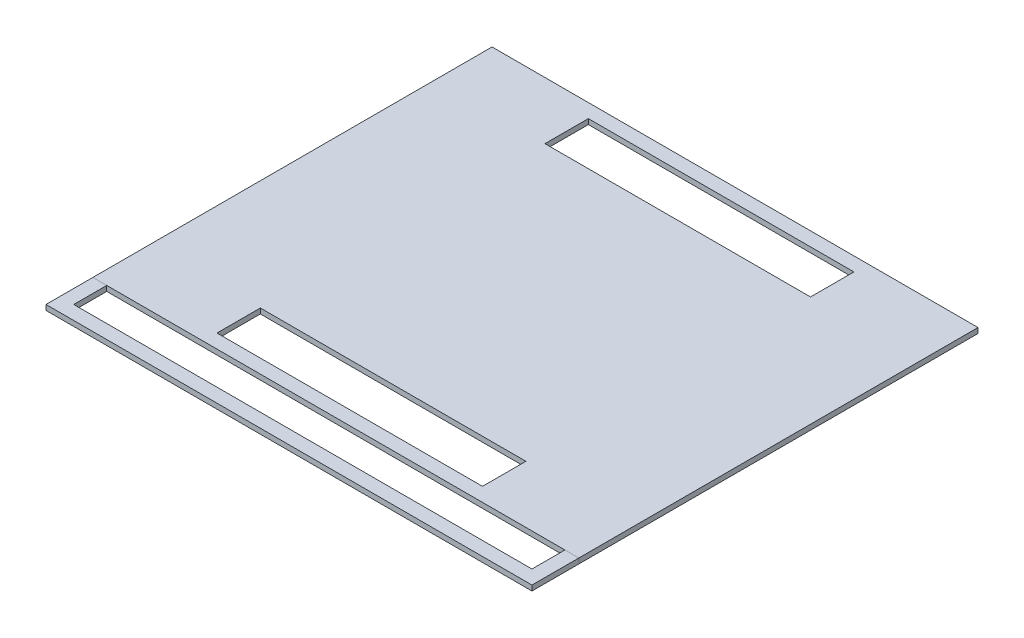
ISO-10303-21;
HEADER;
FILE_DESCRIPTION(('STEP AP214'),'2;1');
FILE_NAME('part.step','',(''),(''),'','','');
FILE_SCHEMA(('AUTOMOTIVE_DESIGN { 1 0 10303 214 1 1 1 1 }'));
ENDSEC;
DATA;
#1=APPLICATION_CONTEXT('core data for automotive mechanical design processes');
#2=APPLICATION_PROTOCOL_DEFINITION('international standard','automotive_design',2000,#1);
#3=PRODUCT_CONTEXT('',#1,'mechanical');
#4=PRODUCT('Part','Part','',(#3));
#5=PRODUCT_RELATED_PRODUCT_CATEGORY('part','',(#4));
#6=PRODUCT_DEFINITION_FORMATION('','',#4);
#7=PRODUCT_DEFINITION_CONTEXT('part definition',#1,'design');
#8=PRODUCT_DEFINITION('design','',#6,#7);
#9=PRODUCT_DEFINITION_SHAPE('','',#8);
#10=(LENGTH_UNIT() NAMED_UNIT(*) SI_UNIT(.MILLI.,.METRE.));
#11=(NAMED_UNIT(*) PLANE_ANGLE_UNIT() SI_UNIT($,.RADIAN.));
#12=(NAMED_UNIT(*) SI_UNIT($,.STERADIAN.) SOLID_ANGLE_UNIT());
#13=UNCERTAINTY_MEASURE_WITH_UNIT(LENGTH_MEASURE(1.E-05),#10,'distance_accuracy_value','');
#14=(GEOMETRIC_REPRESENTATION_CONTEXT(3) GLOBAL_UNCERTAINTY_ASSIGNED_CONTEXT((#13)) GLOBAL_UNIT_ASSIGNED_CONTEXT((#10,
#11,#12)) REPRESENTATION_CONTEXT('',''));
#15=CARTESIAN_POINT('',(0.,0.,0.));
#16=DIRECTION('',(0.,0.,1.));
#17=DIRECTION('',(1.,0.,0.));
#18=AXIS2_PLACEMENT_3D('',#15,#16,#17);
#19=CARTESIAN_POINT('',(-280.,0.,0.));
#20=DIRECTION('',(0.,0.,-1.));
#21=DIRECTION('',(-1.,0.,0.));
#22=AXIS2_PLACEMENT_3D('',#19,#20,#21);
#23=PLANE('',#22);
#24=DIRECTION('',(0.,1.,0.));
#25=VECTOR('',#24,1.);
#26=CARTESIAN_POINT('',(-272.,0.,0.));
#27=LINE('',#26,#25);
#28=CARTESIAN_POINT('',(-272.,0.,0.));
#29=VERTEX_POINT('',#28);
#30=CARTESIAN_POINT('',(-272.,3.,0.));
#31=VERTEX_POINT('',#30);
#32=EDGE_CURVE('E150',#29,#31,#27,.T.);
#33=ORIENTED_EDGE('',*,*,#32,.F.);
#34=DIRECTION('',(-1.,0.,0.));
#35=VECTOR('',#34,1.);
#36=CARTESIAN_POINT('',(-280.,0.,0.));
#37=LINE('',#36,#35);
#38=CARTESIAN_POINT('',(-280.,0.,0.));
#39=VERTEX_POINT('',#38);
#40=EDGE_CURVE('E74',#29,#39,#37,.T.);
#41=ORIENTED_EDGE('',*,*,#40,.T.);
#42=DIRECTION('',(0.,1.,0.));
#43=VECTOR('',#42,1.);
#44=CARTESIAN_POINT('',(-280.,0.,0.));
#45=LINE('',#44,#43);
#46=CARTESIAN_POINT('',(-280.,3.,0.));
#47=VERTEX_POINT('',#46);
#48=EDGE_CURVE('E12',#39,#47,#45,.T.);
#49=ORIENTED_EDGE('',*,*,#48,.T.);
#50=DIRECTION('',(-1.,0.,0.));
#51=VECTOR('',#50,1.);
#52=CARTESIAN_POINT('',(-280.,3.,0.));
#53=LINE('',#52,#51);
#54=EDGE_CURVE('E96',#31,#47,#53,.T.);
#55=ORIENTED_EDGE('',*,*,#54,.F.);
#56=EDGE_LOOP('',(#33,#41,#49,#55));
#57=FACE_BOUND('',#56,.T.);
#58=ADVANCED_FACE('F49',(#57),#23,.T.);
#59=CARTESIAN_POINT('',(-280.,0.,0.));
#60=DIRECTION('',(-1.,0.,0.));
#61=DIRECTION('',(0.,0.,1.));
#62=AXIS2_PLACEMENT_3D('',#59,#60,#61);
#63=PLANE('',#62);
#64=DIRECTION('',(0.,0.,1.));
#65=VECTOR('',#64,1.);
#66=CARTESIAN_POINT('',(-280.,3.,0.));
#67=LINE('',#66,#65);
#68=CARTESIAN_POINT('',(-280.,3.,27.));
#69=VERTEX_POINT('',#68);
#70=EDGE_CURVE('E152',#47,#69,#67,.T.);
#71=ORIENTED_EDGE('',*,*,#70,.F.);
#72=ORIENTED_EDGE('',*,*,#48,.F.);
#73=DIRECTION('',(0.,0.,1.));
#74=VECTOR('',#73,1.);
#75=CARTESIAN_POINT('',(-280.,0.,0.));
#76=LINE('',#75,#74);
#77=CARTESIAN_POINT('',(-280.,0.,27.));
#78=VERTEX_POINT('',#77);
#79=EDGE_CURVE('E157',#39,#78,#76,.T.);
#80=ORIENTED_EDGE('',*,*,#79,.T.);
#81=DIRECTION('',(0.,1.,0.));
#82=VECTOR('',#81,1.);
#83=CARTESIAN_POINT('',(-280.,0.,27.));
#84=LINE('',#83,#82);
#85=EDGE_CURVE('E53',#78,#69,#84,.T.);
#86=ORIENTED_EDGE('',*,*,#85,.T.);
#87=EDGE_LOOP('',(#71,#72,#80,#86));
#88=FACE_BOUND('',#87,.T.);
#89=ADVANCED_FACE('F51',(#88),#63,.T.);
#90=DIRECTION('',(0.,1.,0.));
#91=VECTOR('',#90,1.);
#92=CARTESIAN_POINT('',(-8.,0.,0.));
#93=LINE('',#92,#91);
#94=CARTESIAN_POINT('',(-8.,0.,0.));
#95=VERTEX_POINT('',#94);
#96=CARTESIAN_POINT('',(-8.,3.,0.));
#97=VERTEX_POINT('',#96);
#98=EDGE_CURVE('E153',#95,#97,#93,.T.);
#99=ORIENTED_EDGE('',*,*,#98,.T.);
#100=CARTESIAN_POINT('',(0.,3.,0.));
#101=VERTEX_POINT('',#100);
#102=EDGE_CURVE('E161',#101,#97,#53,.T.);
#103=ORIENTED_EDGE('',*,*,#102,.F.);
#104=DIRECTION('',(0.,1.,0.));
#105=VECTOR('',#104,1.);
#106=CARTESIAN_POINT('',(0.,0.,0.));
#107=LINE('',#106,#105);
#108=CARTESIAN_POINT('',(0.,0.,0.));
#109=VERTEX_POINT('',#108);
#110=EDGE_CURVE('E58',#109,#101,#107,.T.);
#111=ORIENTED_EDGE('',*,*,#110,.F.);
#112=EDGE_CURVE('E166',#109,#95,#37,.T.);
#113=ORIENTED_EDGE('',*,*,#112,.T.);
#114=EDGE_LOOP('',(#99,#103,#111,#113));
#115=FACE_BOUND('',#114,.T.);
#116=ADVANCED_FACE('F195',(#115),#23,.T.);
#117=CARTESIAN_POINT('',(0.,0.,0.));
#118=DIRECTION('',(1.,0.,0.));
#119=DIRECTION('',(0.,0.,-1.));
#120=AXIS2_PLACEMENT_3D('',#117,#118,#119);
#121=PLANE('',#120);
#122=DIRECTION('',(0.,0.,-1.));
#123=VECTOR('',#122,1.);
#124=CARTESIAN_POINT('',(0.,3.,0.));
#125=LINE('',#124,#123);
#126=CARTESIAN_POINT('',(0.,3.,27.));
#127=VERTEX_POINT('',#126);
#128=EDGE_CURVE('E173',#127,#101,#125,.T.);
#129=ORIENTED_EDGE('',*,*,#128,.F.);
#130=DIRECTION('',(0.,1.,0.));
#131=VECTOR('',#130,1.);
#132=CARTESIAN_POINT('',(0.,0.,27.));
#133=LINE('',#132,#131);
#134=CARTESIAN_POINT('',(0.,0.,27.));
#135=VERTEX_POINT('',#134);
#136=EDGE_CURVE('E178',#135,#127,#133,.T.);
#137=ORIENTED_EDGE('',*,*,#136,.F.);
#138=DIRECTION('',(0.,0.,-1.));
#139=VECTOR('',#138,1.);
#140=CARTESIAN_POINT('',(0.,0.,0.));
#141=LINE('',#140,#139);
#142=EDGE_CURVE('E163',#135,#109,#141,.T.);
#143=ORIENTED_EDGE('',*,*,#142,.T.);
#144=ORIENTED_EDGE('',*,*,#110,.T.);
#145=EDGE_LOOP('',(#129,#137,#143,#144));
#146=FACE_BOUND('',#145,.T.);
#147=ADVANCED_FACE('F201',(#146),#121,.T.);
#148=CARTESIAN_POINT('',(-280.,0.,27.));
#149=DIRECTION('',(0.,0.,1.));
#150=DIRECTION('',(1.,0.,0.));
#151=AXIS2_PLACEMENT_3D('',#148,#149,#150);
#152=PLANE('',#151);
#153=DIRECTION('',(1.,0.,0.));
#154=VECTOR('',#153,1.);
#155=CARTESIAN_POINT('',(-280.,3.,27.));
#156=LINE('',#155,#154);
#157=EDGE_CURVE('E170',#69,#127,#156,.T.);
#158=ORIENTED_EDGE('',*,*,#157,.F.);
#159=ORIENTED_EDGE('',*,*,#85,.F.);
#160=DIRECTION('',(1.,0.,0.));
#161=VECTOR('',#160,1.);
#162=CARTESIAN_POINT('',(-280.,0.,27.));
#163=LINE('',#162,#161);
#164=EDGE_CURVE('E160',#78,#135,#163,.T.);
#165=ORIENTED_EDGE('',*,*,#164,.T.);
#166=ORIENTED_EDGE('',*,*,#136,.T.);
#167=EDGE_LOOP('',(#158,#159,#165,#166));
#168=FACE_BOUND('',#167,.T.);
#169=ADVANCED_FACE('F182',(#168),#152,.T.);
#170=CARTESIAN_POINT('',(0.,0.,0.));
#171=DIRECTION('',(0.,1.,0.));
#172=DIRECTION('',(0.,0.,1.));
#173=AXIS2_PLACEMENT_3D('',#170,#171,#172);
#174=PLANE('',#173);
#175=ORIENTED_EDGE('',*,*,#40,.F.);
#176=DIRECTION('',(0.,0.,1.));
#177=VECTOR('',#176,1.);
#178=CARTESIAN_POINT('',(-272.,0.,19.));
#179=LINE('',#178,#177);
#180=CARTESIAN_POINT('',(-272.,0.,19.));
#181=VERTEX_POINT('',#180);
#182=EDGE_CURVE('E126',#29,#181,#179,.T.);
#183=ORIENTED_EDGE('',*,*,#182,.T.);
#184=DIRECTION('',(1.,0.,0.));
#185=VECTOR('',#184,1.);
#186=CARTESIAN_POINT('',(-272.,0.,19.));
#187=LINE('',#186,#185);
#188=CARTESIAN_POINT('',(-8.,0.,19.));
#189=VERTEX_POINT('',#188);
#190=EDGE_CURVE('E134',#181,#189,#187,.T.);
#191=ORIENTED_EDGE('',*,*,#190,.T.);
#192=DIRECTION('',(0.,0.,-1.));
#193=VECTOR('',#192,1.);
#194=CARTESIAN_POINT('',(-8.,0.,19.));
#195=LINE('',#194,#193);
#196=EDGE_CURVE('E131',#189,#95,#195,.T.);
#197=ORIENTED_EDGE('',*,*,#196,.T.);
#198=ORIENTED_EDGE('',*,*,#112,.F.);
#199=ORIENTED_EDGE('',*,*,#142,.F.);
#200=ORIENTED_EDGE('',*,*,#164,.F.);
#201=ORIENTED_EDGE('',*,*,#79,.F.);
#202=EDGE_LOOP('',(#175,#183,#191,#197,#198,#199,#200,#201));
#203=FACE_BOUND('',#202,.T.);
#204=ADVANCED_FACE('F140',(#203),#174,.F.);
#205=CARTESIAN_POINT('',(0.,3.,0.));
#206=DIRECTION('',(0.,1.,0.));
#207=DIRECTION('',(0.,0.,1.));
#208=AXIS2_PLACEMENT_3D('',#205,#206,#207);
#209=PLANE('',#208);
#210=DIRECTION('',(0.,0.,1.));
#211=VECTOR('',#210,1.);
#212=CARTESIAN_POINT('',(-272.,3.,19.));
#213=LINE('',#212,#211);
#214=CARTESIAN_POINT('',(-272.,3.,19.));
#215=VERTEX_POINT('',#214);
#216=EDGE_CURVE('E66',#31,#215,#213,.T.);
#217=ORIENTED_EDGE('',*,*,#216,.F.);
#218=ORIENTED_EDGE('',*,*,#54,.T.);
#219=ORIENTED_EDGE('',*,*,#70,.T.);
#220=ORIENTED_EDGE('',*,*,#157,.T.);
#221=ORIENTED_EDGE('',*,*,#128,.T.);
#222=ORIENTED_EDGE('',*,*,#102,.T.);
#223=DIRECTION('',(0.,0.,-1.));
#224=VECTOR('',#223,1.);
#225=CARTESIAN_POINT('',(-8.,3.,19.));
#226=LINE('',#225,#224);
#227=CARTESIAN_POINT('',(-8.,3.,19.));
#228=VERTEX_POINT('',#227);
#229=EDGE_CURVE('E142',#228,#97,#226,.T.);
#230=ORIENTED_EDGE('',*,*,#229,.F.);
#231=DIRECTION('',(1.,0.,0.));
#232=VECTOR('',#231,1.);
#233=CARTESIAN_POINT('',(-272.,3.,19.));
#234=LINE('',#233,#232);
#235=EDGE_CURVE('E144',#215,#228,#234,.T.);
#236=ORIENTED_EDGE('',*,*,#235,.F.);
#237=EDGE_LOOP('',(#217,#218,#219,#220,#221,#222,#230,#236));
#238=FACE_BOUND('',#237,.T.);
#239=ADVANCED_FACE('F183',(#238),#209,.T.);
#240=CARTESIAN_POINT('',(-272.,0.,19.));
#241=DIRECTION('',(-1.,0.,0.));
#242=DIRECTION('',(0.,0.,1.));
#243=AXIS2_PLACEMENT_3D('',#240,#241,#242);
#244=PLANE('',#243);
#245=ORIENTED_EDGE('',*,*,#216,.T.);
#246=DIRECTION('',(0.,1.,0.));
#247=VECTOR('',#246,1.);
#248=CARTESIAN_POINT('',(-272.,0.,19.));
#249=LINE('',#248,#247);
#250=EDGE_CURVE('E122',#181,#215,#249,.T.);
#251=ORIENTED_EDGE('',*,*,#250,.F.);
#252=ORIENTED_EDGE('',*,*,#182,.F.);
#253=ORIENTED_EDGE('',*,*,#32,.T.);
#254=EDGE_LOOP('',(#245,#251,#252,#253));
#255=FACE_BOUND('',#254,.T.);
#256=ADVANCED_FACE('F124',(#255),#244,.F.);
#257=CARTESIAN_POINT('',(-8.,0.,19.));
#258=DIRECTION('',(1.,0.,0.));
#259=DIRECTION('',(0.,0.,-1.));
#260=AXIS2_PLACEMENT_3D('',#257,#258,#259);
#261=PLANE('',#260);
#262=ORIENTED_EDGE('',*,*,#229,.T.);
#263=ORIENTED_EDGE('',*,*,#98,.F.);
#264=ORIENTED_EDGE('',*,*,#196,.F.);
#265=DIRECTION('',(0.,1.,0.));
#266=VECTOR('',#265,1.);
#267=CARTESIAN_POINT('',(-8.,0.,19.));
#268=LINE('',#267,#266);
#269=EDGE_CURVE('E130',#189,#228,#268,.T.);
#270=ORIENTED_EDGE('',*,*,#269,.T.);
#271=EDGE_LOOP('',(#262,#263,#264,#270));
#272=FACE_BOUND('',#271,.T.);
#273=ADVANCED_FACE('F190',(#272),#261,.F.);
#274=CARTESIAN_POINT('',(-272.,0.,19.));
#275=DIRECTION('',(0.,0.,1.));
#276=DIRECTION('',(1.,0.,0.));
#277=AXIS2_PLACEMENT_3D('',#274,#275,#276);
#278=PLANE('',#277);
#279=ORIENTED_EDGE('',*,*,#235,.T.);
#280=ORIENTED_EDGE('',*,*,#269,.F.);
#281=ORIENTED_EDGE('',*,*,#190,.F.);
#282=ORIENTED_EDGE('',*,*,#250,.T.);
#283=EDGE_LOOP('',(#279,#280,#281,#282));
#284=FACE_BOUND('',#283,.T.);
#285=ADVANCED_FACE('F135',(#284),#278,.F.);
#286=CLOSED_SHELL('',(#58,#89,#116,#147,#169,#204,#239,#256,#273,#285));
#287=MANIFOLD_SOLID_BREP('B2',#286);
#288=CARTESIAN_POINT('',(0.,3.,0.));
#289=DIRECTION('',(-1.,0.,0.));
#290=DIRECTION('',(0.,0.,1.));
#291=AXIS2_PLACEMENT_3D('',#288,#289,#290);
#292=PLANE('',#291);
#293=DIRECTION('',(0.,0.,-1.));
#294=VECTOR('',#293,1.);
#295=CARTESIAN_POINT('',(0.,0.,0.));
#296=LINE('',#295,#294);
#297=CARTESIAN_POINT('',(0.,0.,0.));
#298=VERTEX_POINT('',#297);
#299=CARTESIAN_POINT('',(0.,0.,-230.));
#300=VERTEX_POINT('',#299);
#301=EDGE_CURVE('E421',#298,#300,#296,.T.);
#302=ORIENTED_EDGE('',*,*,#301,.T.);
#303=DIRECTION('',(0.,-1.,0.));
#304=VECTOR('',#303,1.);
#305=CARTESIAN_POINT('',(0.,3.,-230.));
#306=LINE('',#305,#304);
#307=CARTESIAN_POINT('',(0.,3.,-230.));
#308=VERTEX_POINT('',#307);
#309=EDGE_CURVE('E47',#308,#300,#306,.T.);
#310=ORIENTED_EDGE('',*,*,#309,.F.);
#311=DIRECTION('',(0.,0.,-1.));
#312=VECTOR('',#311,1.);
#313=CARTESIAN_POINT('',(0.,3.,0.));
#314=LINE('',#313,#312);
#315=CARTESIAN_POINT('',(0.,3.,0.));
#316=VERTEX_POINT('',#315);
#317=EDGE_CURVE('E454',#316,#308,#314,.T.);
#318=ORIENTED_EDGE('',*,*,#317,.F.);
#319=DIRECTION('',(0.,-1.,0.));
#320=VECTOR('',#319,1.);
#321=CARTESIAN_POINT('',(0.,3.,0.));
#322=LINE('',#321,#320);
#323=EDGE_CURVE('E464',#316,#298,#322,.T.);
#324=ORIENTED_EDGE('',*,*,#323,.T.);
#325=EDGE_LOOP('',(#302,#310,#318,#324));
#326=FACE_BOUND('',#325,.T.);
#327=ADVANCED_FACE('F296',(#326),#292,.F.);
#328=CARTESIAN_POINT('',(0.,3.,-230.));
#329=DIRECTION('',(0.,0.,1.));
#330=DIRECTION('',(1.,0.,0.));
#331=AXIS2_PLACEMENT_3D('',#328,#329,#330);
#332=PLANE('',#331);
#333=DIRECTION('',(-1.,0.,0.));
#334=VECTOR('',#333,1.);
#335=CARTESIAN_POINT('',(0.,0.,-230.));
#336=LINE('',#335,#334);
#337=CARTESIAN_POINT('',(-280.,0.,-230.));
#338=VERTEX_POINT('',#337);
#339=EDGE_CURVE('E467',#300,#338,#336,.T.);
#340=ORIENTED_EDGE('',*,*,#339,.T.);
#341=DIRECTION('',(0.,-1.,0.));
#342=VECTOR('',#341,1.);
#343=CARTESIAN_POINT('',(-280.,3.,-230.));
#344=LINE('',#343,#342);
#345=CARTESIAN_POINT('',(-280.,3.,-230.));
#346=VERTEX_POINT('',#345);
#347=EDGE_CURVE('E303',#346,#338,#344,.T.);
#348=ORIENTED_EDGE('',*,*,#347,.F.);
#349=DIRECTION('',(-1.,0.,0.));
#350=VECTOR('',#349,1.);
#351=CARTESIAN_POINT('',(0.,3.,-230.));
#352=LINE('',#351,#350);
#353=EDGE_CURVE('E457',#308,#346,#352,.T.);
#354=ORIENTED_EDGE('',*,*,#353,.F.);
#355=ORIENTED_EDGE('',*,*,#309,.T.);
#356=EDGE_LOOP('',(#340,#348,#354,#355));
#357=FACE_BOUND('',#356,.T.);
#358=ADVANCED_FACE('F496',(#357),#332,.F.);
#359=CARTESIAN_POINT('',(-280.,3.,0.));
#360=DIRECTION('',(1.,0.,0.));
#361=DIRECTION('',(0.,0.,-1.));
#362=AXIS2_PLACEMENT_3D('',#359,#360,#361);
#363=PLANE('',#362);
#364=DIRECTION('',(0.,0.,1.));
#365=VECTOR('',#364,1.);
#366=CARTESIAN_POINT('',(-280.,0.,0.));
#367=LINE('',#366,#365);
#368=CARTESIAN_POINT('',(-280.,0.,0.));
#369=VERTEX_POINT('',#368);
#370=EDGE_CURVE('E469',#338,#369,#367,.T.);
#371=ORIENTED_EDGE('',*,*,#370,.T.);
#372=DIRECTION('',(0.,-1.,0.));
#373=VECTOR('',#372,1.);
#374=CARTESIAN_POINT('',(-280.,3.,0.));
#375=LINE('',#374,#373);
#376=CARTESIAN_POINT('',(-280.,3.,0.));
#377=VERTEX_POINT('',#376);
#378=EDGE_CURVE('E474',#377,#369,#375,.T.);
#379=ORIENTED_EDGE('',*,*,#378,.F.);
#380=DIRECTION('',(0.,0.,1.));
#381=VECTOR('',#380,1.);
#382=CARTESIAN_POINT('',(-280.,3.,0.));
#383=LINE('',#382,#381);
#384=EDGE_CURVE('E460',#346,#377,#383,.T.);
#385=ORIENTED_EDGE('',*,*,#384,.F.);
#386=ORIENTED_EDGE('',*,*,#347,.T.);
#387=EDGE_LOOP('',(#371,#379,#385,#386));
#388=FACE_BOUND('',#387,.T.);
#389=ADVANCED_FACE('F481',(#388),#363,.F.);
#390=CARTESIAN_POINT('',(0.,3.,0.));
#391=DIRECTION('',(0.,0.,-1.));
#392=DIRECTION('',(-1.,0.,0.));
#393=AXIS2_PLACEMENT_3D('',#390,#391,#392);
#394=PLANE('',#393);
#395=DIRECTION('',(1.,0.,0.));
#396=VECTOR('',#395,1.);
#397=CARTESIAN_POINT('',(0.,0.,0.));
#398=LINE('',#397,#396);
#399=EDGE_CURVE('E458',#369,#298,#398,.T.);
#400=ORIENTED_EDGE('',*,*,#399,.T.);
#401=ORIENTED_EDGE('',*,*,#323,.F.);
#402=DIRECTION('',(1.,0.,0.));
#403=VECTOR('',#402,1.);
#404=CARTESIAN_POINT('',(0.,3.,0.));
#405=LINE('',#404,#403);
#406=EDGE_CURVE('E462',#377,#316,#405,.T.);
#407=ORIENTED_EDGE('',*,*,#406,.F.);
#408=ORIENTED_EDGE('',*,*,#378,.T.);
#409=EDGE_LOOP('',(#400,#401,#407,#408));
#410=FACE_BOUND('',#409,.T.);
#411=ADVANCED_FACE('F489',(#410),#394,.F.);
#412=CARTESIAN_POINT('',(0.,3.,0.));
#413=DIRECTION('',(0.,1.,0.));
#414=DIRECTION('',(0.,0.,1.));
#415=AXIS2_PLACEMENT_3D('',#412,#413,#414);
#416=PLANE('',#415);
#417=DIRECTION('',(1.,0.,0.));
#418=VECTOR('',#417,1.);
#419=CARTESIAN_POINT('',(-63.5,3.,-197.));
#420=LINE('',#419,#418);
#421=CARTESIAN_POINT('',(-216.5,3.,-197.));
#422=VERTEX_POINT('',#421);
#423=CARTESIAN_POINT('',(-63.5,3.,-197.));
#424=VERTEX_POINT('',#423);
#425=EDGE_CURVE('E310',#422,#424,#420,.T.);
#426=ORIENTED_EDGE('',*,*,#425,.F.);
#427=DIRECTION('',(0.,0.,1.));
#428=VECTOR('',#427,1.);
#429=CARTESIAN_POINT('',(-216.5,3.,-222.));
#430=LINE('',#429,#428);
#431=CARTESIAN_POINT('',(-216.5,3.,-222.));
#432=VERTEX_POINT('',#431);
#433=EDGE_CURVE('E405',#432,#422,#430,.T.);
#434=ORIENTED_EDGE('',*,*,#433,.F.);
#435=DIRECTION('',(-1.,0.,0.));
#436=VECTOR('',#435,1.);
#437=CARTESIAN_POINT('',(-63.5,3.,-222.));
#438=LINE('',#437,#436);
#439=CARTESIAN_POINT('',(-63.5,3.,-222.));
#440=VERTEX_POINT('',#439);
#441=EDGE_CURVE('E408',#440,#432,#438,.T.);
#442=ORIENTED_EDGE('',*,*,#441,.F.);
#443=DIRECTION('',(0.,0.,-1.));
#444=VECTOR('',#443,1.);
#445=CARTESIAN_POINT('',(-63.5,3.,-222.));
#446=LINE('',#445,#444);
#447=EDGE_CURVE('E414',#424,#440,#446,.T.);
#448=ORIENTED_EDGE('',*,*,#447,.F.);
#449=EDGE_LOOP('',(#426,#434,#442,#448));
#450=FACE_BOUND('',#449,.T.);
#451=DIRECTION('',(0.,0.,1.));
#452=VECTOR('',#451,1.);
#453=CARTESIAN_POINT('',(-216.5,3.,-8.00000000000001));
#454=LINE('',#453,#452);
#455=CARTESIAN_POINT('',(-216.5,3.,-33.));
#456=VERTEX_POINT('',#455);
#457=CARTESIAN_POINT('',(-216.5,3.,-8.00000000000001));
#458=VERTEX_POINT('',#457);
#459=EDGE_CURVE('E318',#456,#458,#454,.T.);
#460=ORIENTED_EDGE('',*,*,#459,.F.);
#461=DIRECTION('',(-1.,0.,0.));
#462=VECTOR('',#461,1.);
#463=CARTESIAN_POINT('',(-216.5,3.,-33.));
#464=LINE('',#463,#462);
#465=CARTESIAN_POINT('',(-63.5,3.,-33.));
#466=VERTEX_POINT('',#465);
#467=EDGE_CURVE('E429',#466,#456,#464,.T.);
#468=ORIENTED_EDGE('',*,*,#467,.F.);
#469=DIRECTION('',(0.,0.,-1.));
#470=VECTOR('',#469,1.);
#471=CARTESIAN_POINT('',(-63.5,3.,-8.00000000000001));
#472=LINE('',#471,#470);
#473=CARTESIAN_POINT('',(-63.5,3.,-8.00000000000001));
#474=VERTEX_POINT('',#473);
#475=EDGE_CURVE('E443',#474,#466,#472,.T.);
#476=ORIENTED_EDGE('',*,*,#475,.F.);
#477=DIRECTION('',(1.,0.,0.));
#478=VECTOR('',#477,1.);
#479=CARTESIAN_POINT('',(-216.5,3.,-8.00000000000001));
#480=LINE('',#479,#478);
#481=EDGE_CURVE('E440',#458,#474,#480,.T.);
#482=ORIENTED_EDGE('',*,*,#481,.F.);
#483=EDGE_LOOP('',(#460,#468,#476,#482));
#484=FACE_BOUND('',#483,.T.);
#485=ORIENTED_EDGE('',*,*,#317,.T.);
#486=ORIENTED_EDGE('',*,*,#353,.T.);
#487=ORIENTED_EDGE('',*,*,#384,.T.);
#488=ORIENTED_EDGE('',*,*,#406,.T.);
#489=EDGE_LOOP('',(#485,#486,#487,#488));
#490=FACE_BOUND('',#489,.T.);
#491=ADVANCED_FACE('F495',(#450,#484,#490),#416,.T.);
#492=CARTESIAN_POINT('',(0.,0.,0.));
#493=DIRECTION('',(0.,1.,0.));
#494=DIRECTION('',(0.,0.,1.));
#495=AXIS2_PLACEMENT_3D('',#492,#493,#494);
#496=PLANE('',#495);
#497=DIRECTION('',(0.,0.,1.));
#498=VECTOR('',#497,1.);
#499=CARTESIAN_POINT('',(-216.5,0.,-222.));
#500=LINE('',#499,#498);
#501=CARTESIAN_POINT('',(-216.5,0.,-222.));
#502=VERTEX_POINT('',#501);
#503=CARTESIAN_POINT('',(-216.5,0.,-197.));
#504=VERTEX_POINT('',#503);
#505=EDGE_CURVE('E392',#502,#504,#500,.T.);
#506=ORIENTED_EDGE('',*,*,#505,.T.);
#507=DIRECTION('',(1.,0.,0.));
#508=VECTOR('',#507,1.);
#509=CARTESIAN_POINT('',(-63.5,0.,-197.));
#510=LINE('',#509,#508);
#511=CARTESIAN_POINT('',(-63.5,0.,-197.));
#512=VERTEX_POINT('',#511);
#513=EDGE_CURVE('E386',#504,#512,#510,.T.);
#514=ORIENTED_EDGE('',*,*,#513,.T.);
#515=DIRECTION('',(0.,0.,-1.));
#516=VECTOR('',#515,1.);
#517=CARTESIAN_POINT('',(-63.5,0.,-222.));
#518=LINE('',#517,#516);
#519=CARTESIAN_POINT('',(-63.5,0.,-222.));
#520=VERTEX_POINT('',#519);
#521=EDGE_CURVE('E396',#512,#520,#518,.T.);
#522=ORIENTED_EDGE('',*,*,#521,.T.);
#523=DIRECTION('',(-1.,0.,0.));
#524=VECTOR('',#523,1.);
#525=CARTESIAN_POINT('',(-63.5,0.,-222.));
#526=LINE('',#525,#524);
#527=EDGE_CURVE('E400',#520,#502,#526,.T.);
#528=ORIENTED_EDGE('',*,*,#527,.T.);
#529=EDGE_LOOP('',(#506,#514,#522,#528));
#530=FACE_BOUND('',#529,.T.);
#531=DIRECTION('',(-1.,0.,0.));
#532=VECTOR('',#531,1.);
#533=CARTESIAN_POINT('',(-216.5,0.,-33.));
#534=LINE('',#533,#532);
#535=CARTESIAN_POINT('',(-63.5,0.,-33.));
#536=VERTEX_POINT('',#535);
#537=CARTESIAN_POINT('',(-216.5,0.,-33.));
#538=VERTEX_POINT('',#537);
#539=EDGE_CURVE('E435',#536,#538,#534,.T.);
#540=ORIENTED_EDGE('',*,*,#539,.T.);
#541=DIRECTION('',(0.,0.,1.));
#542=VECTOR('',#541,1.);
#543=CARTESIAN_POINT('',(-216.5,0.,-8.00000000000001));
#544=LINE('',#543,#542);
#545=CARTESIAN_POINT('',(-216.5,0.,-8.00000000000001));
#546=VERTEX_POINT('',#545);
#547=EDGE_CURVE('E425',#538,#546,#544,.T.);
#548=ORIENTED_EDGE('',*,*,#547,.T.);
#549=DIRECTION('',(1.,0.,0.));
#550=VECTOR('',#549,1.);
#551=CARTESIAN_POINT('',(-216.5,0.,-8.00000000000001));
#552=LINE('',#551,#550);
#553=CARTESIAN_POINT('',(-63.5,0.,-8.00000000000001));
#554=VERTEX_POINT('',#553);
#555=EDGE_CURVE('E428',#546,#554,#552,.T.);
#556=ORIENTED_EDGE('',*,*,#555,.T.);
#557=DIRECTION('',(0.,0.,-1.));
#558=VECTOR('',#557,1.);
#559=CARTESIAN_POINT('',(-63.5,0.,-8.00000000000001));
#560=LINE('',#559,#558);
#561=EDGE_CURVE('E432',#554,#536,#560,.T.);
#562=ORIENTED_EDGE('',*,*,#561,.T.);
#563=EDGE_LOOP('',(#540,#548,#556,#562));
#564=FACE_BOUND('',#563,.T.);
#565=ORIENTED_EDGE('',*,*,#301,.F.);
#566=ORIENTED_EDGE('',*,*,#399,.F.);
#567=ORIENTED_EDGE('',*,*,#370,.F.);
#568=ORIENTED_EDGE('',*,*,#339,.F.);
#569=EDGE_LOOP('',(#565,#566,#567,#568));
#570=FACE_BOUND('',#569,.T.);
#571=ADVANCED_FACE('F402',(#530,#564,#570),#496,.F.);
#572=CARTESIAN_POINT('',(-216.5,0.,-8.00000000000001));
#573=DIRECTION('',(-1.,0.,0.));
#574=DIRECTION('',(0.,0.,1.));
#575=AXIS2_PLACEMENT_3D('',#572,#573,#574);
#576=PLANE('',#575);
#577=ORIENTED_EDGE('',*,*,#459,.T.);
#578=DIRECTION('',(0.,1.,0.));
#579=VECTOR('',#578,1.);
#580=CARTESIAN_POINT('',(-216.5,0.,-8.00000000000001));
#581=LINE('',#580,#579);
#582=EDGE_CURVE('E438',#546,#458,#581,.T.);
#583=ORIENTED_EDGE('',*,*,#582,.F.);
#584=ORIENTED_EDGE('',*,*,#547,.F.);
#585=DIRECTION('',(0.,1.,0.));
#586=VECTOR('',#585,1.);
#587=CARTESIAN_POINT('',(-216.5,0.,-33.));
#588=LINE('',#587,#586);
#589=EDGE_CURVE('E415',#538,#456,#588,.T.);
#590=ORIENTED_EDGE('',*,*,#589,.T.);
#591=EDGE_LOOP('',(#577,#583,#584,#590));
#592=FACE_BOUND('',#591,.T.);
#593=ADVANCED_FACE('F509',(#592),#576,.F.);
#594=CARTESIAN_POINT('',(-216.5,0.,-33.));
#595=DIRECTION('',(0.,0.,-1.));
#596=DIRECTION('',(-1.,0.,0.));
#597=AXIS2_PLACEMENT_3D('',#594,#595,#596);
#598=PLANE('',#597);
#599=ORIENTED_EDGE('',*,*,#467,.T.);
#600=ORIENTED_EDGE('',*,*,#589,.F.);
#601=ORIENTED_EDGE('',*,*,#539,.F.);
#602=DIRECTION('',(0.,1.,0.));
#603=VECTOR('',#602,1.);
#604=CARTESIAN_POINT('',(-63.5,0.,-33.));
#605=LINE('',#604,#603);
#606=EDGE_CURVE('E449',#536,#466,#605,.T.);
#607=ORIENTED_EDGE('',*,*,#606,.T.);
#608=EDGE_LOOP('',(#599,#600,#601,#607));
#609=FACE_BOUND('',#608,.T.);
#610=ADVANCED_FACE('F515',(#609),#598,.F.);
#611=CARTESIAN_POINT('',(-63.5,0.,-8.00000000000001));
#612=DIRECTION('',(1.,0.,0.));
#613=DIRECTION('',(0.,0.,-1.));
#614=AXIS2_PLACEMENT_3D('',#611,#612,#613);
#615=PLANE('',#614);
#616=ORIENTED_EDGE('',*,*,#475,.T.);
#617=ORIENTED_EDGE('',*,*,#606,.F.);
#618=ORIENTED_EDGE('',*,*,#561,.F.);
#619=DIRECTION('',(0.,1.,0.));
#620=VECTOR('',#619,1.);
#621=CARTESIAN_POINT('',(-63.5,0.,-8.00000000000001));
#622=LINE('',#621,#620);
#623=EDGE_CURVE('E451',#554,#474,#622,.T.);
#624=ORIENTED_EDGE('',*,*,#623,.T.);
#625=EDGE_LOOP('',(#616,#617,#618,#624));
#626=FACE_BOUND('',#625,.T.);
#627=ADVANCED_FACE('F519',(#626),#615,.F.);
#628=CARTESIAN_POINT('',(-216.5,0.,-8.00000000000001));
#629=DIRECTION('',(0.,0.,1.));
#630=DIRECTION('',(1.,0.,0.));
#631=AXIS2_PLACEMENT_3D('',#628,#629,#630);
#632=PLANE('',#631);
#633=ORIENTED_EDGE('',*,*,#481,.T.);
#634=ORIENTED_EDGE('',*,*,#623,.F.);
#635=ORIENTED_EDGE('',*,*,#555,.F.);
#636=ORIENTED_EDGE('',*,*,#582,.T.);
#637=EDGE_LOOP('',(#633,#634,#635,#636));
#638=FACE_BOUND('',#637,.T.);
#639=ADVANCED_FACE('F516',(#638),#632,.F.);
#640=CARTESIAN_POINT('',(-63.5,0.,-197.));
#641=DIRECTION('',(0.,0.,1.));
#642=DIRECTION('',(1.,0.,0.));
#643=AXIS2_PLACEMENT_3D('',#640,#641,#642);
#644=PLANE('',#643);
#645=ORIENTED_EDGE('',*,*,#425,.T.);
#646=DIRECTION('',(0.,1.,0.));
#647=VECTOR('',#646,1.);
#648=CARTESIAN_POINT('',(-63.5,0.,-197.));
#649=LINE('',#648,#647);
#650=EDGE_CURVE('E382',#512,#424,#649,.T.);
#651=ORIENTED_EDGE('',*,*,#650,.F.);
#652=ORIENTED_EDGE('',*,*,#513,.F.);
#653=DIRECTION('',(0.,1.,0.));
#654=VECTOR('',#653,1.);
#655=CARTESIAN_POINT('',(-216.5,0.,-197.));
#656=LINE('',#655,#654);
#657=EDGE_CURVE('E419',#504,#422,#656,.T.);
#658=ORIENTED_EDGE('',*,*,#657,.T.);
#659=EDGE_LOOP('',(#645,#651,#652,#658));
#660=FACE_BOUND('',#659,.T.);
#661=ADVANCED_FACE('F384',(#660),#644,.F.);
#662=CARTESIAN_POINT('',(-216.5,0.,-222.));
#663=DIRECTION('',(-1.,0.,0.));
#664=DIRECTION('',(0.,0.,1.));
#665=AXIS2_PLACEMENT_3D('',#662,#663,#664);
#666=PLANE('',#665);
#667=ORIENTED_EDGE('',*,*,#433,.T.);
#668=ORIENTED_EDGE('',*,*,#657,.F.);
#669=ORIENTED_EDGE('',*,*,#505,.F.);
#670=DIRECTION('',(0.,1.,0.));
#671=VECTOR('',#670,1.);
#672=CARTESIAN_POINT('',(-216.5,0.,-222.));
#673=LINE('',#672,#671);
#674=EDGE_CURVE('E422',#502,#432,#673,.T.);
#675=ORIENTED_EDGE('',*,*,#674,.T.);
#676=EDGE_LOOP('',(#667,#668,#669,#675));
#677=FACE_BOUND('',#676,.T.);
#678=ADVANCED_FACE('F529',(#677),#666,.F.);
#679=CARTESIAN_POINT('',(-63.5,0.,-222.));
#680=DIRECTION('',(0.,0.,-1.));
#681=DIRECTION('',(-1.,0.,0.));
#682=AXIS2_PLACEMENT_3D('',#679,#680,#681);
#683=PLANE('',#682);
#684=ORIENTED_EDGE('',*,*,#441,.T.);
#685=ORIENTED_EDGE('',*,*,#674,.F.);
#686=ORIENTED_EDGE('',*,*,#527,.F.);
#687=DIRECTION('',(0.,1.,0.));
#688=VECTOR('',#687,1.);
#689=CARTESIAN_POINT('',(-63.5,0.,-222.));
#690=LINE('',#689,#688);
#691=EDGE_CURVE('E391',#520,#440,#690,.T.);
#692=ORIENTED_EDGE('',*,*,#691,.T.);
#693=EDGE_LOOP('',(#684,#685,#686,#692));
#694=FACE_BOUND('',#693,.T.);
#695=ADVANCED_FACE('F532',(#694),#683,.F.);
#696=CARTESIAN_POINT('',(-63.5,0.,-222.));
#697=DIRECTION('',(1.,0.,0.));
#698=DIRECTION('',(0.,0.,-1.));
#699=AXIS2_PLACEMENT_3D('',#696,#697,#698);
#700=PLANE('',#699);
#701=ORIENTED_EDGE('',*,*,#447,.T.);
#702=ORIENTED_EDGE('',*,*,#691,.F.);
#703=ORIENTED_EDGE('',*,*,#521,.F.);
#704=ORIENTED_EDGE('',*,*,#650,.T.);
#705=EDGE_LOOP('',(#701,#702,#703,#704));
#706=FACE_BOUND('',#705,.T.);
#707=ADVANCED_FACE('F397',(#706),#700,.F.);
#708=CLOSED_SHELL('',(#327,#358,#389,#411,#491,#571,#593,#610,#627,#639,#661,#678,#695,#707));
#709=MANIFOLD_SOLID_BREP('B6',#708);
#710=ADVANCED_BREP_SHAPE_REPRESENTATION('',(#18,#287,#709),#14);
#711=SHAPE_DEFINITION_REPRESENTATION(#9,#710);
ENDSEC;
END-ISO-10303-21;
